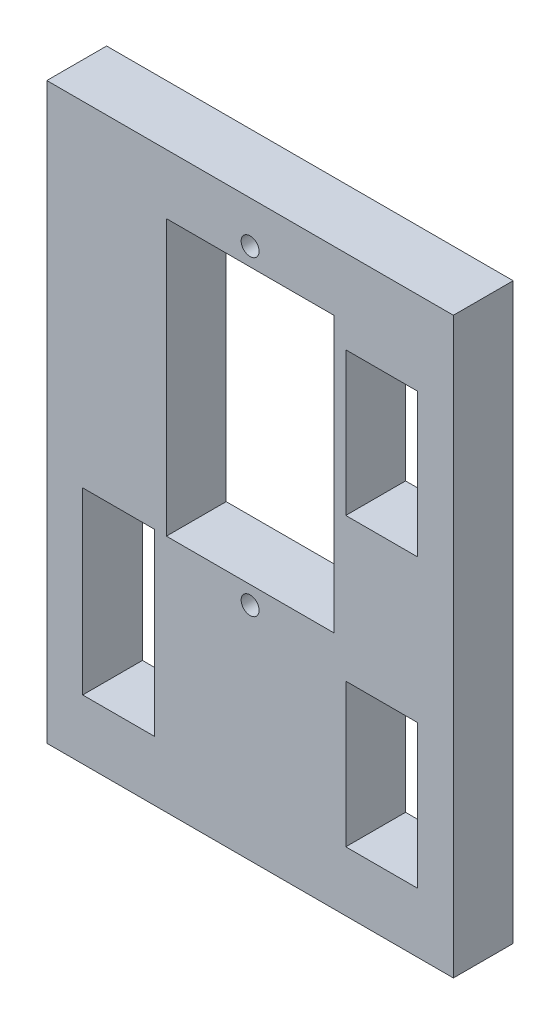
ISO-10303-21;
HEADER;
FILE_DESCRIPTION(('STEP AP214'),'2;1');
FILE_NAME('part.step','',(''),(''),'','','');
FILE_SCHEMA(('AUTOMOTIVE_DESIGN { 1 0 10303 214 1 1 1 1 }'));
ENDSEC;
DATA;
#1=APPLICATION_CONTEXT('core data for automotive mechanical design processes');
#2=APPLICATION_PROTOCOL_DEFINITION('international standard','automotive_design',2000,#1);
#3=PRODUCT_CONTEXT('',#1,'mechanical');
#4=PRODUCT('Part','Part','',(#3));
#5=PRODUCT_RELATED_PRODUCT_CATEGORY('part','',(#4));
#6=PRODUCT_DEFINITION_FORMATION('','',#4);
#7=PRODUCT_DEFINITION_CONTEXT('part definition',#1,'design');
#8=PRODUCT_DEFINITION('design','',#6,#7);
#9=PRODUCT_DEFINITION_SHAPE('','',#8);
#10=(LENGTH_UNIT() NAMED_UNIT(*) SI_UNIT(.MILLI.,.METRE.));
#11=(NAMED_UNIT(*) PLANE_ANGLE_UNIT() SI_UNIT($,.RADIAN.));
#12=(NAMED_UNIT(*) SI_UNIT($,.STERADIAN.) SOLID_ANGLE_UNIT());
#13=UNCERTAINTY_MEASURE_WITH_UNIT(LENGTH_MEASURE(1.E-05),#10,'distance_accuracy_value','');
#14=(GEOMETRIC_REPRESENTATION_CONTEXT(3) GLOBAL_UNCERTAINTY_ASSIGNED_CONTEXT((#13)) GLOBAL_UNIT_ASSIGNED_CONTEXT((#10,
#11,#12)) REPRESENTATION_CONTEXT('',''));
#15=CARTESIAN_POINT('',(0.,0.,0.));
#16=DIRECTION('',(0.,0.,1.));
#17=DIRECTION('',(1.,0.,0.));
#18=AXIS2_PLACEMENT_3D('',#15,#16,#17);
#19=CARTESIAN_POINT('',(0.,0.,5.));
#20=DIRECTION('',(0.,0.,-1.));
#21=DIRECTION('',(-1.,0.,0.));
#22=AXIS2_PLACEMENT_3D('',#19,#20,#21);
#23=PLANE('',#22);
#24=DIRECTION('',(0.,1.,0.));
#25=VECTOR('',#24,1.);
#26=CARTESIAN_POINT('',(31.,29.,5.));
#27=LINE('',#26,#25);
#28=CARTESIAN_POINT('',(31.,29.,5.));
#29=VERTEX_POINT('',#28);
#30=CARTESIAN_POINT('',(31.,41.,5.));
#31=VERTEX_POINT('',#30);
#32=EDGE_CURVE('E206',#29,#31,#27,.T.);
#33=ORIENTED_EDGE('',*,*,#32,.F.);
#34=DIRECTION('',(1.,0.,0.));
#35=VECTOR('',#34,1.);
#36=CARTESIAN_POINT('',(31.,29.,5.));
#37=LINE('',#36,#35);
#38=CARTESIAN_POINT('',(25.,29.,5.));
#39=VERTEX_POINT('',#38);
#40=EDGE_CURVE('E214',#39,#29,#37,.T.);
#41=ORIENTED_EDGE('',*,*,#40,.F.);
#42=DIRECTION('',(0.,-1.,0.));
#43=VECTOR('',#42,1.);
#44=CARTESIAN_POINT('',(25.,29.,5.));
#45=LINE('',#44,#43);
#46=CARTESIAN_POINT('',(25.,41.,5.));
#47=VERTEX_POINT('',#46);
#48=EDGE_CURVE('E211',#47,#39,#45,.T.);
#49=ORIENTED_EDGE('',*,*,#48,.F.);
#50=DIRECTION('',(-1.,0.,0.));
#51=VECTOR('',#50,1.);
#52=CARTESIAN_POINT('',(31.,41.,5.));
#53=LINE('',#52,#51);
#54=EDGE_CURVE('E208',#31,#47,#53,.T.);
#55=ORIENTED_EDGE('',*,*,#54,.F.);
#56=EDGE_LOOP('',(#33,#41,#49,#55));
#57=FACE_BOUND('',#56,.T.);
#58=CARTESIAN_POINT('',(17.,44.5,5.));
#59=DIRECTION('',(0.,0.,1.));
#60=DIRECTION('',(1.,0.,0.));
#61=AXIS2_PLACEMENT_3D('',#58,#59,#60);
#62=CIRCLE('',#61,0.750000000000002);
#63=CARTESIAN_POINT('',(17.75,44.5,5.));
#64=VERTEX_POINT('',#63);
#65=EDGE_CURVE('E268',#64,#64,#62,.T.);
#66=ORIENTED_EDGE('',*,*,#65,.F.);
#67=EDGE_LOOP('',(#66));
#68=FACE_BOUND('',#67,.T.);
#69=CARTESIAN_POINT('',(17.,18.5,5.));
#70=DIRECTION('',(0.,0.,1.));
#71=DIRECTION('',(1.,0.,0.));
#72=AXIS2_PLACEMENT_3D('',#69,#70,#71);
#73=CIRCLE('',#72,0.750000000000002);
#74=CARTESIAN_POINT('',(17.75,18.5,5.));
#75=VERTEX_POINT('',#74);
#76=EDGE_CURVE('E274',#75,#75,#73,.T.);
#77=ORIENTED_EDGE('',*,*,#76,.F.);
#78=EDGE_LOOP('',(#77));
#79=FACE_BOUND('',#78,.T.);
#80=DIRECTION('',(0.,-1.,0.));
#81=VECTOR('',#80,1.);
#82=CARTESIAN_POINT('',(10.,20.,5.));
#83=LINE('',#82,#81);
#84=CARTESIAN_POINT('',(10.,43.,5.));
#85=VERTEX_POINT('',#84);
#86=CARTESIAN_POINT('',(10.,20.,5.));
#87=VERTEX_POINT('',#86);
#88=EDGE_CURVE('E280',#85,#87,#83,.T.);
#89=ORIENTED_EDGE('',*,*,#88,.F.);
#90=DIRECTION('',(-1.,0.,0.));
#91=VECTOR('',#90,1.);
#92=CARTESIAN_POINT('',(24.,43.,5.));
#93=LINE('',#92,#91);
#94=CARTESIAN_POINT('',(24.,43.,5.));
#95=VERTEX_POINT('',#94);
#96=EDGE_CURVE('E288',#95,#85,#93,.T.);
#97=ORIENTED_EDGE('',*,*,#96,.F.);
#98=DIRECTION('',(0.,1.,0.));
#99=VECTOR('',#98,1.);
#100=CARTESIAN_POINT('',(24.,20.,5.));
#101=LINE('',#100,#99);
#102=CARTESIAN_POINT('',(24.,20.,5.));
#103=VERTEX_POINT('',#102);
#104=EDGE_CURVE('E285',#103,#95,#101,.T.);
#105=ORIENTED_EDGE('',*,*,#104,.F.);
#106=DIRECTION('',(1.,0.,0.));
#107=VECTOR('',#106,1.);
#108=CARTESIAN_POINT('',(24.,20.,5.));
#109=LINE('',#108,#107);
#110=EDGE_CURVE('E282',#87,#103,#109,.T.);
#111=ORIENTED_EDGE('',*,*,#110,.F.);
#112=EDGE_LOOP('',(#89,#97,#105,#111));
#113=FACE_BOUND('',#112,.T.);
#114=DIRECTION('',(0.,-1.,0.));
#115=VECTOR('',#114,1.);
#116=CARTESIAN_POINT('',(0.,0.,5.));
#117=LINE('',#116,#115);
#118=CARTESIAN_POINT('',(0.,48.,5.));
#119=VERTEX_POINT('',#118);
#120=CARTESIAN_POINT('',(0.,0.,5.));
#121=VERTEX_POINT('',#120);
#122=EDGE_CURVE('E311',#119,#121,#117,.T.);
#123=ORIENTED_EDGE('',*,*,#122,.T.);
#124=DIRECTION('',(1.,0.,0.));
#125=VECTOR('',#124,1.);
#126=CARTESIAN_POINT('',(0.,0.,5.));
#127=LINE('',#126,#125);
#128=CARTESIAN_POINT('',(34.,0.,5.));
#129=VERTEX_POINT('',#128);
#130=EDGE_CURVE('E314',#121,#129,#127,.T.);
#131=ORIENTED_EDGE('',*,*,#130,.T.);
#132=DIRECTION('',(0.,1.,0.));
#133=VECTOR('',#132,1.);
#134=CARTESIAN_POINT('',(34.,0.,5.));
#135=LINE('',#134,#133);
#136=CARTESIAN_POINT('',(33.9999999999999,48.,5.));
#137=VERTEX_POINT('',#136);
#138=EDGE_CURVE('E317',#129,#137,#135,.T.);
#139=ORIENTED_EDGE('',*,*,#138,.T.);
#140=DIRECTION('',(-1.,0.,0.));
#141=VECTOR('',#140,1.);
#142=CARTESIAN_POINT('',(0.,48.,5.));
#143=LINE('',#142,#141);
#144=EDGE_CURVE('E319',#137,#119,#143,.T.);
#145=ORIENTED_EDGE('',*,*,#144,.T.);
#146=EDGE_LOOP('',(#123,#131,#139,#145));
#147=FACE_BOUND('',#146,.T.);
#148=DIRECTION('',(0.,1.,0.));
#149=VECTOR('',#148,1.);
#150=CARTESIAN_POINT('',(31.,5.,5.));
#151=LINE('',#150,#149);
#152=CARTESIAN_POINT('',(31.,5.,5.));
#153=VERTEX_POINT('',#152);
#154=CARTESIAN_POINT('',(31.,17.,5.));
#155=VERTEX_POINT('',#154);
#156=EDGE_CURVE('E237',#153,#155,#151,.T.);
#157=ORIENTED_EDGE('',*,*,#156,.F.);
#158=DIRECTION('',(1.,0.,0.));
#159=VECTOR('',#158,1.);
#160=CARTESIAN_POINT('',(31.,5.,5.));
#161=LINE('',#160,#159);
#162=CARTESIAN_POINT('',(25.,5.,5.));
#163=VERTEX_POINT('',#162);
#164=EDGE_CURVE('E245',#163,#153,#161,.T.);
#165=ORIENTED_EDGE('',*,*,#164,.F.);
#166=DIRECTION('',(0.,-1.,0.));
#167=VECTOR('',#166,1.);
#168=CARTESIAN_POINT('',(25.,5.,5.));
#169=LINE('',#168,#167);
#170=CARTESIAN_POINT('',(25.,17.,5.));
#171=VERTEX_POINT('',#170);
#172=EDGE_CURVE('E242',#171,#163,#169,.T.);
#173=ORIENTED_EDGE('',*,*,#172,.F.);
#174=DIRECTION('',(-1.,0.,0.));
#175=VECTOR('',#174,1.);
#176=CARTESIAN_POINT('',(31.,17.,5.));
#177=LINE('',#176,#175);
#178=EDGE_CURVE('E239',#155,#171,#177,.T.);
#179=ORIENTED_EDGE('',*,*,#178,.F.);
#180=EDGE_LOOP('',(#157,#165,#173,#179));
#181=FACE_BOUND('',#180,.T.);
#182=DIRECTION('',(0.,1.,0.));
#183=VECTOR('',#182,1.);
#184=CARTESIAN_POINT('',(9.00000000000001,5.,5.));
#185=LINE('',#184,#183);
#186=CARTESIAN_POINT('',(9.00000000000001,5.,5.));
#187=VERTEX_POINT('',#186);
#188=CARTESIAN_POINT('',(8.99999999999993,20.,5.));
#189=VERTEX_POINT('',#188);
#190=EDGE_CURVE('E170',#187,#189,#185,.T.);
#191=ORIENTED_EDGE('',*,*,#190,.F.);
#192=DIRECTION('',(1.,0.,0.));
#193=VECTOR('',#192,1.);
#194=CARTESIAN_POINT('',(9.00000000000001,5.,5.));
#195=LINE('',#194,#193);
#196=CARTESIAN_POINT('',(3.00000000000001,5.,5.));
#197=VERTEX_POINT('',#196);
#198=EDGE_CURVE('E192',#197,#187,#195,.T.);
#199=ORIENTED_EDGE('',*,*,#198,.F.);
#200=DIRECTION('',(0.,-1.,0.));
#201=VECTOR('',#200,1.);
#202=CARTESIAN_POINT('',(3.00000000000001,5.,5.));
#203=LINE('',#202,#201);
#204=CARTESIAN_POINT('',(2.99999999999994,20.,5.));
#205=VERTEX_POINT('',#204);
#206=EDGE_CURVE('E190',#205,#197,#203,.T.);
#207=ORIENTED_EDGE('',*,*,#206,.F.);
#208=DIRECTION('',(-1.,0.,0.));
#209=VECTOR('',#208,1.);
#210=CARTESIAN_POINT('',(8.99999999999993,20.,5.));
#211=LINE('',#210,#209);
#212=EDGE_CURVE('E178',#189,#205,#211,.T.);
#213=ORIENTED_EDGE('',*,*,#212,.F.);
#214=EDGE_LOOP('',(#191,#199,#207,#213));
#215=FACE_BOUND('',#214,.T.);
#216=ADVANCED_FACE('F33',(#57,#68,#79,#113,#147,#181,#215),#23,.F.);
#217=CARTESIAN_POINT('',(0.,0.,0.));
#218=DIRECTION('',(0.,0.,-1.));
#219=DIRECTION('',(-1.,0.,0.));
#220=AXIS2_PLACEMENT_3D('',#217,#218,#219);
#221=PLANE('',#220);
#222=CARTESIAN_POINT('',(17.,18.5,0.));
#223=DIRECTION('',(0.,0.,1.));
#224=DIRECTION('',(1.,0.,0.));
#225=AXIS2_PLACEMENT_3D('',#222,#223,#224);
#226=CIRCLE('',#225,0.750000000000002);
#227=CARTESIAN_POINT('',(17.75,18.5,0.));
#228=VERTEX_POINT('',#227);
#229=EDGE_CURVE('E271',#228,#228,#226,.T.);
#230=ORIENTED_EDGE('',*,*,#229,.T.);
#231=EDGE_LOOP('',(#230));
#232=FACE_BOUND('',#231,.T.);
#233=DIRECTION('',(0.,-1.,0.));
#234=VECTOR('',#233,1.);
#235=CARTESIAN_POINT('',(0.,0.,0.));
#236=LINE('',#235,#234);
#237=CARTESIAN_POINT('',(0.,48.,0.));
#238=VERTEX_POINT('',#237);
#239=CARTESIAN_POINT('',(0.,0.,0.));
#240=VERTEX_POINT('',#239);
#241=EDGE_CURVE('E310',#238,#240,#236,.T.);
#242=ORIENTED_EDGE('',*,*,#241,.F.);
#243=DIRECTION('',(-1.,0.,0.));
#244=VECTOR('',#243,1.);
#245=CARTESIAN_POINT('',(0.,48.,0.));
#246=LINE('',#245,#244);
#247=CARTESIAN_POINT('',(33.9999999999999,48.,0.));
#248=VERTEX_POINT('',#247);
#249=EDGE_CURVE('E315',#248,#238,#246,.T.);
#250=ORIENTED_EDGE('',*,*,#249,.F.);
#251=DIRECTION('',(0.,1.,0.));
#252=VECTOR('',#251,1.);
#253=CARTESIAN_POINT('',(34.,0.,0.));
#254=LINE('',#253,#252);
#255=CARTESIAN_POINT('',(34.,0.,0.));
#256=VERTEX_POINT('',#255);
#257=EDGE_CURVE('E326',#256,#248,#254,.T.);
#258=ORIENTED_EDGE('',*,*,#257,.F.);
#259=DIRECTION('',(1.,0.,0.));
#260=VECTOR('',#259,1.);
#261=CARTESIAN_POINT('',(0.,0.,0.));
#262=LINE('',#261,#260);
#263=EDGE_CURVE('E324',#240,#256,#262,.T.);
#264=ORIENTED_EDGE('',*,*,#263,.F.);
#265=EDGE_LOOP('',(#242,#250,#258,#264));
#266=FACE_BOUND('',#265,.T.);
#267=DIRECTION('',(-1.,0.,0.));
#268=VECTOR('',#267,1.);
#269=CARTESIAN_POINT('',(24.,43.,0.));
#270=LINE('',#269,#268);
#271=CARTESIAN_POINT('',(24.,43.,0.));
#272=VERTEX_POINT('',#271);
#273=CARTESIAN_POINT('',(10.,43.,0.));
#274=VERTEX_POINT('',#273);
#275=EDGE_CURVE('E283',#272,#274,#270,.T.);
#276=ORIENTED_EDGE('',*,*,#275,.T.);
#277=DIRECTION('',(0.,-1.,0.));
#278=VECTOR('',#277,1.);
#279=CARTESIAN_POINT('',(10.,20.,0.));
#280=LINE('',#279,#278);
#281=CARTESIAN_POINT('',(10.,20.,0.));
#282=VERTEX_POINT('',#281);
#283=EDGE_CURVE('E277',#274,#282,#280,.T.);
#284=ORIENTED_EDGE('',*,*,#283,.T.);
#285=DIRECTION('',(1.,0.,0.));
#286=VECTOR('',#285,1.);
#287=CARTESIAN_POINT('',(24.,20.,0.));
#288=LINE('',#287,#286);
#289=CARTESIAN_POINT('',(24.,20.,0.));
#290=VERTEX_POINT('',#289);
#291=EDGE_CURVE('E293',#282,#290,#288,.T.);
#292=ORIENTED_EDGE('',*,*,#291,.T.);
#293=DIRECTION('',(0.,1.,0.));
#294=VECTOR('',#293,1.);
#295=CARTESIAN_POINT('',(24.,20.,0.));
#296=LINE('',#295,#294);
#297=EDGE_CURVE('E296',#290,#272,#296,.T.);
#298=ORIENTED_EDGE('',*,*,#297,.T.);
#299=EDGE_LOOP('',(#276,#284,#292,#298));
#300=FACE_BOUND('',#299,.T.);
#301=CARTESIAN_POINT('',(17.,44.5,0.));
#302=DIRECTION('',(0.,0.,1.));
#303=DIRECTION('',(1.,0.,0.));
#304=AXIS2_PLACEMENT_3D('',#301,#302,#303);
#305=CIRCLE('',#304,0.750000000000002);
#306=CARTESIAN_POINT('',(17.75,44.5,0.));
#307=VERTEX_POINT('',#306);
#308=EDGE_CURVE('E267',#307,#307,#305,.T.);
#309=ORIENTED_EDGE('',*,*,#308,.T.);
#310=EDGE_LOOP('',(#309));
#311=FACE_BOUND('',#310,.T.);
#312=DIRECTION('',(1.,0.,0.));
#313=VECTOR('',#312,1.);
#314=CARTESIAN_POINT('',(31.,5.,0.));
#315=LINE('',#314,#313);
#316=CARTESIAN_POINT('',(25.,5.,0.));
#317=VERTEX_POINT('',#316);
#318=CARTESIAN_POINT('',(31.,5.,0.));
#319=VERTEX_POINT('',#318);
#320=EDGE_CURVE('E240',#317,#319,#315,.T.);
#321=ORIENTED_EDGE('',*,*,#320,.T.);
#322=DIRECTION('',(0.,1.,0.));
#323=VECTOR('',#322,1.);
#324=CARTESIAN_POINT('',(31.,5.,0.));
#325=LINE('',#324,#323);
#326=CARTESIAN_POINT('',(31.,17.,0.));
#327=VERTEX_POINT('',#326);
#328=EDGE_CURVE('E236',#319,#327,#325,.T.);
#329=ORIENTED_EDGE('',*,*,#328,.T.);
#330=DIRECTION('',(-1.,0.,0.));
#331=VECTOR('',#330,1.);
#332=CARTESIAN_POINT('',(31.,17.,0.));
#333=LINE('',#332,#331);
#334=CARTESIAN_POINT('',(25.,17.,0.));
#335=VERTEX_POINT('',#334);
#336=EDGE_CURVE('E250',#327,#335,#333,.T.);
#337=ORIENTED_EDGE('',*,*,#336,.T.);
#338=DIRECTION('',(0.,-1.,0.));
#339=VECTOR('',#338,1.);
#340=CARTESIAN_POINT('',(25.,5.,0.));
#341=LINE('',#340,#339);
#342=EDGE_CURVE('E253',#335,#317,#341,.T.);
#343=ORIENTED_EDGE('',*,*,#342,.T.);
#344=EDGE_LOOP('',(#321,#329,#337,#343));
#345=FACE_BOUND('',#344,.T.);
#346=DIRECTION('',(1.,0.,0.));
#347=VECTOR('',#346,1.);
#348=CARTESIAN_POINT('',(31.,29.,0.));
#349=LINE('',#348,#347);
#350=CARTESIAN_POINT('',(25.,29.,0.));
#351=VERTEX_POINT('',#350);
#352=CARTESIAN_POINT('',(31.,29.,0.));
#353=VERTEX_POINT('',#352);
#354=EDGE_CURVE('E209',#351,#353,#349,.T.);
#355=ORIENTED_EDGE('',*,*,#354,.T.);
#356=DIRECTION('',(0.,1.,0.));
#357=VECTOR('',#356,1.);
#358=CARTESIAN_POINT('',(31.,29.,0.));
#359=LINE('',#358,#357);
#360=CARTESIAN_POINT('',(31.,41.,0.));
#361=VERTEX_POINT('',#360);
#362=EDGE_CURVE('E186',#353,#361,#359,.T.);
#363=ORIENTED_EDGE('',*,*,#362,.T.);
#364=DIRECTION('',(-1.,0.,0.));
#365=VECTOR('',#364,1.);
#366=CARTESIAN_POINT('',(31.,41.,0.));
#367=LINE('',#366,#365);
#368=CARTESIAN_POINT('',(25.,41.,0.));
#369=VERTEX_POINT('',#368);
#370=EDGE_CURVE('E219',#361,#369,#367,.T.);
#371=ORIENTED_EDGE('',*,*,#370,.T.);
#372=DIRECTION('',(0.,-1.,0.));
#373=VECTOR('',#372,1.);
#374=CARTESIAN_POINT('',(25.,29.,0.));
#375=LINE('',#374,#373);
#376=EDGE_CURVE('E222',#369,#351,#375,.T.);
#377=ORIENTED_EDGE('',*,*,#376,.T.);
#378=EDGE_LOOP('',(#355,#363,#371,#377));
#379=FACE_BOUND('',#378,.T.);
#380=DIRECTION('',(1.,0.,0.));
#381=VECTOR('',#380,1.);
#382=CARTESIAN_POINT('',(9.00000000000001,5.,0.));
#383=LINE('',#382,#381);
#384=CARTESIAN_POINT('',(3.00000000000001,5.,0.));
#385=VERTEX_POINT('',#384);
#386=CARTESIAN_POINT('',(9.00000000000001,5.,0.));
#387=VERTEX_POINT('',#386);
#388=EDGE_CURVE('E179',#385,#387,#383,.T.);
#389=ORIENTED_EDGE('',*,*,#388,.T.);
#390=DIRECTION('',(0.,1.,0.));
#391=VECTOR('',#390,1.);
#392=CARTESIAN_POINT('',(9.00000000000001,5.,0.));
#393=LINE('',#392,#391);
#394=CARTESIAN_POINT('',(8.99999999999993,20.,0.));
#395=VERTEX_POINT('',#394);
#396=EDGE_CURVE('E56',#387,#395,#393,.T.);
#397=ORIENTED_EDGE('',*,*,#396,.T.);
#398=DIRECTION('',(-1.,0.,0.));
#399=VECTOR('',#398,1.);
#400=CARTESIAN_POINT('',(8.99999999999993,20.,0.));
#401=LINE('',#400,#399);
#402=CARTESIAN_POINT('',(2.99999999999994,20.,0.));
#403=VERTEX_POINT('',#402);
#404=EDGE_CURVE('E185',#395,#403,#401,.T.);
#405=ORIENTED_EDGE('',*,*,#404,.T.);
#406=DIRECTION('',(0.,-1.,0.));
#407=VECTOR('',#406,1.);
#408=CARTESIAN_POINT('',(3.00000000000001,5.,0.));
#409=LINE('',#408,#407);
#410=EDGE_CURVE('E198',#403,#385,#409,.T.);
#411=ORIENTED_EDGE('',*,*,#410,.T.);
#412=EDGE_LOOP('',(#389,#397,#405,#411));
#413=FACE_BOUND('',#412,.T.);
#414=ADVANCED_FACE('F344',(#232,#266,#300,#311,#345,#379,#413),#221,.T.);
#415=CARTESIAN_POINT('',(0.,0.,5.));
#416=DIRECTION('',(1.,0.,0.));
#417=DIRECTION('',(0.,0.,-1.));
#418=AXIS2_PLACEMENT_3D('',#415,#416,#417);
#419=PLANE('',#418);
#420=ORIENTED_EDGE('',*,*,#241,.T.);
#421=DIRECTION('',(0.,0.,-1.));
#422=VECTOR('',#421,1.);
#423=CARTESIAN_POINT('',(0.,0.,5.));
#424=LINE('',#423,#422);
#425=EDGE_CURVE('E11',#121,#240,#424,.T.);
#426=ORIENTED_EDGE('',*,*,#425,.F.);
#427=ORIENTED_EDGE('',*,*,#122,.F.);
#428=DIRECTION('',(0.,0.,-1.));
#429=VECTOR('',#428,1.);
#430=CARTESIAN_POINT('',(0.,48.,5.));
#431=LINE('',#430,#429);
#432=EDGE_CURVE('E321',#119,#238,#431,.T.);
#433=ORIENTED_EDGE('',*,*,#432,.T.);
#434=EDGE_LOOP('',(#420,#426,#427,#433));
#435=FACE_BOUND('',#434,.T.);
#436=ADVANCED_FACE('F35',(#435),#419,.F.);
#437=CARTESIAN_POINT('',(0.,0.,5.));
#438=DIRECTION('',(0.,1.,0.));
#439=DIRECTION('',(0.,0.,1.));
#440=AXIS2_PLACEMENT_3D('',#437,#438,#439);
#441=PLANE('',#440);
#442=ORIENTED_EDGE('',*,*,#263,.T.);
#443=DIRECTION('',(0.,0.,-1.));
#444=VECTOR('',#443,1.);
#445=CARTESIAN_POINT('',(34.,0.,5.));
#446=LINE('',#445,#444);
#447=EDGE_CURVE('E41',#129,#256,#446,.T.);
#448=ORIENTED_EDGE('',*,*,#447,.F.);
#449=ORIENTED_EDGE('',*,*,#130,.F.);
#450=ORIENTED_EDGE('',*,*,#425,.T.);
#451=EDGE_LOOP('',(#442,#448,#449,#450));
#452=FACE_BOUND('',#451,.T.);
#453=ADVANCED_FACE('F355',(#452),#441,.F.);
#454=CARTESIAN_POINT('',(34.,0.,5.));
#455=DIRECTION('',(-1.,0.,0.));
#456=DIRECTION('',(0.,-1.,0.));
#457=AXIS2_PLACEMENT_3D('',#454,#455,#456);
#458=PLANE('',#457);
#459=ORIENTED_EDGE('',*,*,#257,.T.);
#460=DIRECTION('',(0.,0.,-1.));
#461=VECTOR('',#460,1.);
#462=CARTESIAN_POINT('',(33.9999999999999,48.,5.));
#463=LINE('',#462,#461);
#464=EDGE_CURVE('E331',#137,#248,#463,.T.);
#465=ORIENTED_EDGE('',*,*,#464,.F.);
#466=ORIENTED_EDGE('',*,*,#138,.F.);
#467=ORIENTED_EDGE('',*,*,#447,.T.);
#468=EDGE_LOOP('',(#459,#465,#466,#467));
#469=FACE_BOUND('',#468,.T.);
#470=ADVANCED_FACE('F338',(#469),#458,.F.);
#471=CARTESIAN_POINT('',(0.,48.,5.));
#472=DIRECTION('',(0.,-1.,0.));
#473=DIRECTION('',(1.,0.,0.));
#474=AXIS2_PLACEMENT_3D('',#471,#472,#473);
#475=PLANE('',#474);
#476=ORIENTED_EDGE('',*,*,#249,.T.);
#477=ORIENTED_EDGE('',*,*,#432,.F.);
#478=ORIENTED_EDGE('',*,*,#144,.F.);
#479=ORIENTED_EDGE('',*,*,#464,.T.);
#480=EDGE_LOOP('',(#476,#477,#478,#479));
#481=FACE_BOUND('',#480,.T.);
#482=ADVANCED_FACE('F348',(#481),#475,.F.);
#483=CARTESIAN_POINT('',(10.,20.,5.));
#484=DIRECTION('',(1.,0.,0.));
#485=DIRECTION('',(0.,1.,0.));
#486=AXIS2_PLACEMENT_3D('',#483,#484,#485);
#487=PLANE('',#486);
#488=ORIENTED_EDGE('',*,*,#283,.F.);
#489=DIRECTION('',(0.,0.,-1.));
#490=VECTOR('',#489,1.);
#491=CARTESIAN_POINT('',(10.,43.,5.));
#492=LINE('',#491,#490);
#493=EDGE_CURVE('E290',#85,#274,#492,.T.);
#494=ORIENTED_EDGE('',*,*,#493,.F.);
#495=ORIENTED_EDGE('',*,*,#88,.T.);
#496=DIRECTION('',(0.,0.,-1.));
#497=VECTOR('',#496,1.);
#498=CARTESIAN_POINT('',(10.,20.,5.));
#499=LINE('',#498,#497);
#500=EDGE_CURVE('E307',#87,#282,#499,.T.);
#501=ORIENTED_EDGE('',*,*,#500,.T.);
#502=EDGE_LOOP('',(#488,#494,#495,#501));
#503=FACE_BOUND('',#502,.T.);
#504=ADVANCED_FACE('F373',(#503),#487,.T.);
#505=CARTESIAN_POINT('',(24.,20.,5.));
#506=DIRECTION('',(0.,1.,0.));
#507=DIRECTION('',(0.,0.,1.));
#508=AXIS2_PLACEMENT_3D('',#505,#506,#507);
#509=PLANE('',#508);
#510=ORIENTED_EDGE('',*,*,#291,.F.);
#511=ORIENTED_EDGE('',*,*,#500,.F.);
#512=ORIENTED_EDGE('',*,*,#110,.T.);
#513=DIRECTION('',(0.,0.,-1.));
#514=VECTOR('',#513,1.);
#515=CARTESIAN_POINT('',(24.,20.,5.));
#516=LINE('',#515,#514);
#517=EDGE_CURVE('E305',#103,#290,#516,.T.);
#518=ORIENTED_EDGE('',*,*,#517,.T.);
#519=EDGE_LOOP('',(#510,#511,#512,#518));
#520=FACE_BOUND('',#519,.T.);
#521=ADVANCED_FACE('F380',(#520),#509,.T.);
#522=CARTESIAN_POINT('',(24.,20.,5.));
#523=DIRECTION('',(-1.,0.,0.));
#524=DIRECTION('',(0.,-1.,0.));
#525=AXIS2_PLACEMENT_3D('',#522,#523,#524);
#526=PLANE('',#525);
#527=ORIENTED_EDGE('',*,*,#297,.F.);
#528=ORIENTED_EDGE('',*,*,#517,.F.);
#529=ORIENTED_EDGE('',*,*,#104,.T.);
#530=DIRECTION('',(0.,0.,-1.));
#531=VECTOR('',#530,1.);
#532=CARTESIAN_POINT('',(24.,43.,5.));
#533=LINE('',#532,#531);
#534=EDGE_CURVE('E303',#95,#272,#533,.T.);
#535=ORIENTED_EDGE('',*,*,#534,.T.);
#536=EDGE_LOOP('',(#527,#528,#529,#535));
#537=FACE_BOUND('',#536,.T.);
#538=ADVANCED_FACE('F385',(#537),#526,.T.);
#539=CARTESIAN_POINT('',(24.,43.,5.));
#540=DIRECTION('',(0.,-1.,0.));
#541=DIRECTION('',(0.,0.,-1.));
#542=AXIS2_PLACEMENT_3D('',#539,#540,#541);
#543=PLANE('',#542);
#544=ORIENTED_EDGE('',*,*,#275,.F.);
#545=ORIENTED_EDGE('',*,*,#534,.F.);
#546=ORIENTED_EDGE('',*,*,#96,.T.);
#547=ORIENTED_EDGE('',*,*,#493,.T.);
#548=EDGE_LOOP('',(#544,#545,#546,#547));
#549=FACE_BOUND('',#548,.T.);
#550=ADVANCED_FACE('F392',(#549),#543,.T.);
#551=CARTESIAN_POINT('',(17.,18.5,5.));
#552=DIRECTION('',(0.,0.,-1.));
#553=DIRECTION('',(-1.,0.,0.));
#554=AXIS2_PLACEMENT_3D('',#551,#552,#553);
#555=CYLINDRICAL_SURFACE('',#554,0.750000000000002);
#556=ORIENTED_EDGE('',*,*,#76,.T.);
#557=EDGE_LOOP('',(#556));
#558=FACE_BOUND('',#557,.T.);
#559=ORIENTED_EDGE('',*,*,#229,.F.);
#560=EDGE_LOOP('',(#559));
#561=FACE_BOUND('',#560,.T.);
#562=ADVANCED_FACE('F406',(#558,#561),#555,.F.);
#563=CARTESIAN_POINT('',(17.,44.5,5.));
#564=DIRECTION('',(0.,0.,-1.));
#565=DIRECTION('',(-1.,0.,0.));
#566=AXIS2_PLACEMENT_3D('',#563,#564,#565);
#567=CYLINDRICAL_SURFACE('',#566,0.750000000000002);
#568=ORIENTED_EDGE('',*,*,#65,.T.);
#569=EDGE_LOOP('',(#568));
#570=FACE_BOUND('',#569,.T.);
#571=ORIENTED_EDGE('',*,*,#308,.F.);
#572=EDGE_LOOP('',(#571));
#573=FACE_BOUND('',#572,.T.);
#574=ADVANCED_FACE('F411',(#570,#573),#567,.F.);
#575=CARTESIAN_POINT('',(31.,5.,5.));
#576=DIRECTION('',(-1.,0.,0.));
#577=DIRECTION('',(0.,0.,1.));
#578=AXIS2_PLACEMENT_3D('',#575,#576,#577);
#579=PLANE('',#578);
#580=ORIENTED_EDGE('',*,*,#328,.F.);
#581=DIRECTION('',(0.,0.,-1.));
#582=VECTOR('',#581,1.);
#583=CARTESIAN_POINT('',(31.,5.,5.));
#584=LINE('',#583,#582);
#585=EDGE_CURVE('E247',#153,#319,#584,.T.);
#586=ORIENTED_EDGE('',*,*,#585,.F.);
#587=ORIENTED_EDGE('',*,*,#156,.T.);
#588=DIRECTION('',(0.,0.,-1.));
#589=VECTOR('',#588,1.);
#590=CARTESIAN_POINT('',(31.,17.,5.));
#591=LINE('',#590,#589);
#592=EDGE_CURVE('E264',#155,#327,#591,.T.);
#593=ORIENTED_EDGE('',*,*,#592,.T.);
#594=EDGE_LOOP('',(#580,#586,#587,#593));
#595=FACE_BOUND('',#594,.T.);
#596=ADVANCED_FACE('F415',(#595),#579,.T.);
#597=CARTESIAN_POINT('',(31.,17.,5.));
#598=DIRECTION('',(0.,-1.,0.));
#599=DIRECTION('',(0.,0.,-1.));
#600=AXIS2_PLACEMENT_3D('',#597,#598,#599);
#601=PLANE('',#600);
#602=ORIENTED_EDGE('',*,*,#336,.F.);
#603=ORIENTED_EDGE('',*,*,#592,.F.);
#604=ORIENTED_EDGE('',*,*,#178,.T.);
#605=DIRECTION('',(0.,0.,-1.));
#606=VECTOR('',#605,1.);
#607=CARTESIAN_POINT('',(25.,17.,5.));
#608=LINE('',#607,#606);
#609=EDGE_CURVE('E262',#171,#335,#608,.T.);
#610=ORIENTED_EDGE('',*,*,#609,.T.);
#611=EDGE_LOOP('',(#602,#603,#604,#610));
#612=FACE_BOUND('',#611,.T.);
#613=ADVANCED_FACE('F419',(#612),#601,.T.);
#614=CARTESIAN_POINT('',(25.,5.,5.));
#615=DIRECTION('',(1.,0.,0.));
#616=DIRECTION('',(0.,0.,-1.));
#617=AXIS2_PLACEMENT_3D('',#614,#615,#616);
#618=PLANE('',#617);
#619=ORIENTED_EDGE('',*,*,#342,.F.);
#620=ORIENTED_EDGE('',*,*,#609,.F.);
#621=ORIENTED_EDGE('',*,*,#172,.T.);
#622=DIRECTION('',(0.,0.,-1.));
#623=VECTOR('',#622,1.);
#624=CARTESIAN_POINT('',(25.,5.,5.));
#625=LINE('',#624,#623);
#626=EDGE_CURVE('E260',#163,#317,#625,.T.);
#627=ORIENTED_EDGE('',*,*,#626,.T.);
#628=EDGE_LOOP('',(#619,#620,#621,#627));
#629=FACE_BOUND('',#628,.T.);
#630=ADVANCED_FACE('F423',(#629),#618,.T.);
#631=CARTESIAN_POINT('',(31.,5.,5.));
#632=DIRECTION('',(0.,1.,0.));
#633=DIRECTION('',(-1.,0.,0.));
#634=AXIS2_PLACEMENT_3D('',#631,#632,#633);
#635=PLANE('',#634);
#636=ORIENTED_EDGE('',*,*,#320,.F.);
#637=ORIENTED_EDGE('',*,*,#626,.F.);
#638=ORIENTED_EDGE('',*,*,#164,.T.);
#639=ORIENTED_EDGE('',*,*,#585,.T.);
#640=EDGE_LOOP('',(#636,#637,#638,#639));
#641=FACE_BOUND('',#640,.T.);
#642=ADVANCED_FACE('F427',(#641),#635,.T.);
#643=CARTESIAN_POINT('',(31.,29.,5.));
#644=DIRECTION('',(-1.,0.,0.));
#645=DIRECTION('',(0.,0.,1.));
#646=AXIS2_PLACEMENT_3D('',#643,#644,#645);
#647=PLANE('',#646);
#648=ORIENTED_EDGE('',*,*,#362,.F.);
#649=DIRECTION('',(0.,0.,-1.));
#650=VECTOR('',#649,1.);
#651=CARTESIAN_POINT('',(31.,29.,5.));
#652=LINE('',#651,#650);
#653=EDGE_CURVE('E216',#29,#353,#652,.T.);
#654=ORIENTED_EDGE('',*,*,#653,.F.);
#655=ORIENTED_EDGE('',*,*,#32,.T.);
#656=DIRECTION('',(0.,0.,-1.));
#657=VECTOR('',#656,1.);
#658=CARTESIAN_POINT('',(31.,41.,5.));
#659=LINE('',#658,#657);
#660=EDGE_CURVE('E233',#31,#361,#659,.T.);
#661=ORIENTED_EDGE('',*,*,#660,.T.);
#662=EDGE_LOOP('',(#648,#654,#655,#661));
#663=FACE_BOUND('',#662,.T.);
#664=ADVANCED_FACE('F431',(#663),#647,.T.);
#665=CARTESIAN_POINT('',(31.,41.,5.));
#666=DIRECTION('',(0.,-1.,0.));
#667=DIRECTION('',(0.,0.,-1.));
#668=AXIS2_PLACEMENT_3D('',#665,#666,#667);
#669=PLANE('',#668);
#670=ORIENTED_EDGE('',*,*,#370,.F.);
#671=ORIENTED_EDGE('',*,*,#660,.F.);
#672=ORIENTED_EDGE('',*,*,#54,.T.);
#673=DIRECTION('',(0.,0.,-1.));
#674=VECTOR('',#673,1.);
#675=CARTESIAN_POINT('',(25.,41.,5.));
#676=LINE('',#675,#674);
#677=EDGE_CURVE('E231',#47,#369,#676,.T.);
#678=ORIENTED_EDGE('',*,*,#677,.T.);
#679=EDGE_LOOP('',(#670,#671,#672,#678));
#680=FACE_BOUND('',#679,.T.);
#681=ADVANCED_FACE('F435',(#680),#669,.T.);
#682=CARTESIAN_POINT('',(25.,29.,5.));
#683=DIRECTION('',(1.,0.,0.));
#684=DIRECTION('',(0.,0.,-1.));
#685=AXIS2_PLACEMENT_3D('',#682,#683,#684);
#686=PLANE('',#685);
#687=ORIENTED_EDGE('',*,*,#376,.F.);
#688=ORIENTED_EDGE('',*,*,#677,.F.);
#689=ORIENTED_EDGE('',*,*,#48,.T.);
#690=DIRECTION('',(0.,0.,-1.));
#691=VECTOR('',#690,1.);
#692=CARTESIAN_POINT('',(25.,29.,5.));
#693=LINE('',#692,#691);
#694=EDGE_CURVE('E229',#39,#351,#693,.T.);
#695=ORIENTED_EDGE('',*,*,#694,.T.);
#696=EDGE_LOOP('',(#687,#688,#689,#695));
#697=FACE_BOUND('',#696,.T.);
#698=ADVANCED_FACE('F439',(#697),#686,.T.);
#699=CARTESIAN_POINT('',(31.,29.,5.));
#700=DIRECTION('',(0.,1.,0.));
#701=DIRECTION('',(0.,0.,1.));
#702=AXIS2_PLACEMENT_3D('',#699,#700,#701);
#703=PLANE('',#702);
#704=ORIENTED_EDGE('',*,*,#354,.F.);
#705=ORIENTED_EDGE('',*,*,#694,.F.);
#706=ORIENTED_EDGE('',*,*,#40,.T.);
#707=ORIENTED_EDGE('',*,*,#653,.T.);
#708=EDGE_LOOP('',(#704,#705,#706,#707));
#709=FACE_BOUND('',#708,.T.);
#710=ADVANCED_FACE('F443',(#709),#703,.T.);
#711=CARTESIAN_POINT('',(9.00000000000001,5.,5.));
#712=DIRECTION('',(-1.,0.,0.));
#713=DIRECTION('',(0.,-1.,0.));
#714=AXIS2_PLACEMENT_3D('',#711,#712,#713);
#715=PLANE('',#714);
#716=ORIENTED_EDGE('',*,*,#396,.F.);
#717=DIRECTION('',(0.,0.,-1.));
#718=VECTOR('',#717,1.);
#719=CARTESIAN_POINT('',(9.00000000000001,5.,5.));
#720=LINE('',#719,#718);
#721=EDGE_CURVE('E174',#187,#387,#720,.T.);
#722=ORIENTED_EDGE('',*,*,#721,.F.);
#723=ORIENTED_EDGE('',*,*,#190,.T.);
#724=DIRECTION('',(0.,0.,-1.));
#725=VECTOR('',#724,1.);
#726=CARTESIAN_POINT('',(8.99999999999993,20.,5.));
#727=LINE('',#726,#725);
#728=EDGE_CURVE('E173',#189,#395,#727,.T.);
#729=ORIENTED_EDGE('',*,*,#728,.T.);
#730=EDGE_LOOP('',(#716,#722,#723,#729));
#731=FACE_BOUND('',#730,.T.);
#732=ADVANCED_FACE('F172',(#731),#715,.T.);
#733=CARTESIAN_POINT('',(8.99999999999993,20.,5.));
#734=DIRECTION('',(0.,-1.,0.));
#735=DIRECTION('',(1.,0.,0.));
#736=AXIS2_PLACEMENT_3D('',#733,#734,#735);
#737=PLANE('',#736);
#738=ORIENTED_EDGE('',*,*,#404,.F.);
#739=ORIENTED_EDGE('',*,*,#728,.F.);
#740=ORIENTED_EDGE('',*,*,#212,.T.);
#741=DIRECTION('',(0.,0.,-1.));
#742=VECTOR('',#741,1.);
#743=CARTESIAN_POINT('',(2.99999999999994,20.,5.));
#744=LINE('',#743,#742);
#745=EDGE_CURVE('E187',#205,#403,#744,.T.);
#746=ORIENTED_EDGE('',*,*,#745,.T.);
#747=EDGE_LOOP('',(#738,#739,#740,#746));
#748=FACE_BOUND('',#747,.T.);
#749=ADVANCED_FACE('F182',(#748),#737,.T.);
#750=CARTESIAN_POINT('',(3.00000000000001,5.,5.));
#751=DIRECTION('',(1.,0.,0.));
#752=DIRECTION('',(0.,1.,0.));
#753=AXIS2_PLACEMENT_3D('',#750,#751,#752);
#754=PLANE('',#753);
#755=ORIENTED_EDGE('',*,*,#410,.F.);
#756=ORIENTED_EDGE('',*,*,#745,.F.);
#757=ORIENTED_EDGE('',*,*,#206,.T.);
#758=DIRECTION('',(0.,0.,-1.));
#759=VECTOR('',#758,1.);
#760=CARTESIAN_POINT('',(3.00000000000001,5.,5.));
#761=LINE('',#760,#759);
#762=EDGE_CURVE('E48',#197,#385,#761,.T.);
#763=ORIENTED_EDGE('',*,*,#762,.T.);
#764=EDGE_LOOP('',(#755,#756,#757,#763));
#765=FACE_BOUND('',#764,.T.);
#766=ADVANCED_FACE('F452',(#765),#754,.T.);
#767=CARTESIAN_POINT('',(9.00000000000001,5.,5.));
#768=DIRECTION('',(0.,1.,0.));
#769=DIRECTION('',(-1.,0.,0.));
#770=AXIS2_PLACEMENT_3D('',#767,#768,#769);
#771=PLANE('',#770);
#772=ORIENTED_EDGE('',*,*,#388,.F.);
#773=ORIENTED_EDGE('',*,*,#762,.F.);
#774=ORIENTED_EDGE('',*,*,#198,.T.);
#775=ORIENTED_EDGE('',*,*,#721,.T.);
#776=EDGE_LOOP('',(#772,#773,#774,#775));
#777=FACE_BOUND('',#776,.T.);
#778=ADVANCED_FACE('F455',(#777),#771,.T.);
#779=CLOSED_SHELL('',(#216,#414,#436,#453,#470,#482,#504,#521,#538,#550,#562,#574,#596,#613,
#630,#642,#664,#681,#698,#710,#732,#749,#766,#778));
#780=MANIFOLD_SOLID_BREP('B2',#779);
#781=ADVANCED_BREP_SHAPE_REPRESENTATION('',(#18,#780),#14);
#782=SHAPE_DEFINITION_REPRESENTATION(#9,#781);
ENDSEC;
END-ISO-10303-21;
